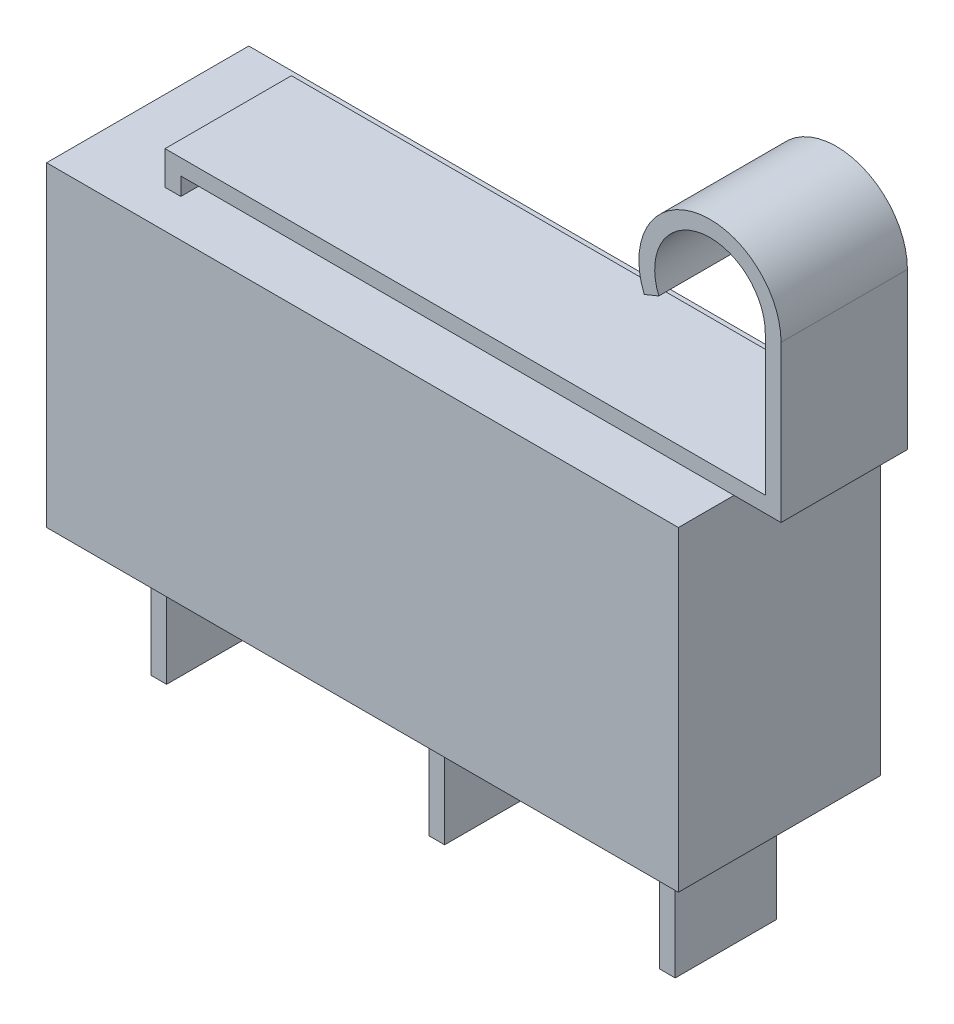
ISO-10303-21;
HEADER;
FILE_DESCRIPTION(('STEP AP214'),'2;1');
FILE_NAME('part.step','',(''),(''),'','','');
FILE_SCHEMA(('AUTOMOTIVE_DESIGN { 1 0 10303 214 1 1 1 1 }'));
ENDSEC;
DATA;
#1=APPLICATION_CONTEXT('core data for automotive mechanical design processes');
#2=APPLICATION_PROTOCOL_DEFINITION('international standard','automotive_design',2000,#1);
#3=PRODUCT_CONTEXT('',#1,'mechanical');
#4=PRODUCT('Part','Part','',(#3));
#5=PRODUCT_RELATED_PRODUCT_CATEGORY('part','',(#4));
#6=PRODUCT_DEFINITION_FORMATION('','',#4);
#7=PRODUCT_DEFINITION_CONTEXT('part definition',#1,'design');
#8=PRODUCT_DEFINITION('design','',#6,#7);
#9=PRODUCT_DEFINITION_SHAPE('','',#8);
#10=(LENGTH_UNIT() NAMED_UNIT(*) SI_UNIT(.MILLI.,.METRE.));
#11=(NAMED_UNIT(*) PLANE_ANGLE_UNIT() SI_UNIT($,.RADIAN.));
#12=(NAMED_UNIT(*) SI_UNIT($,.STERADIAN.) SOLID_ANGLE_UNIT());
#13=UNCERTAINTY_MEASURE_WITH_UNIT(LENGTH_MEASURE(1.E-05),#10,'distance_accuracy_value','');
#14=(GEOMETRIC_REPRESENTATION_CONTEXT(3) GLOBAL_UNCERTAINTY_ASSIGNED_CONTEXT((#13)) GLOBAL_UNIT_ASSIGNED_CONTEXT((#10,
#11,#12)) REPRESENTATION_CONTEXT('',''));
#15=CARTESIAN_POINT('',(0.,0.,0.));
#16=DIRECTION('',(0.,0.,1.));
#17=DIRECTION('',(1.,0.,0.));
#18=AXIS2_PLACEMENT_3D('',#15,#16,#17);
#19=CARTESIAN_POINT('',(-20.,0.,3.2));
#20=DIRECTION('',(0.,1.,0.));
#21=DIRECTION('',(0.,0.,1.));
#22=AXIS2_PLACEMENT_3D('',#19,#20,#21);
#23=PLANE('',#22);
#24=DIRECTION('',(0.,0.,1.));
#25=VECTOR('',#24,1.);
#26=CARTESIAN_POINT('',(-9.5,0.,1.6));
#27=LINE('',#26,#25);
#28=CARTESIAN_POINT('',(-9.5,0.,1.6));
#29=VERTEX_POINT('',#28);
#30=CARTESIAN_POINT('',(-9.5,0.,-1.6));
#31=VERTEX_POINT('',#30);
#32=EDGE_CURVE('E324',#29,#31,#27,.F.);
#33=ORIENTED_EDGE('',*,*,#32,.F.);
#34=DIRECTION('',(1.,0.,0.));
#35=VECTOR('',#34,1.);
#36=CARTESIAN_POINT('',(-9.5,0.,1.6));
#37=LINE('',#36,#35);
#38=CARTESIAN_POINT('',(-9.,0.,1.6));
#39=VERTEX_POINT('',#38);
#40=EDGE_CURVE('E328',#29,#39,#37,.T.);
#41=ORIENTED_EDGE('',*,*,#40,.T.);
#42=DIRECTION('',(0.,0.,1.));
#43=VECTOR('',#42,1.);
#44=CARTESIAN_POINT('',(-9.,0.,1.6));
#45=LINE('',#44,#43);
#46=CARTESIAN_POINT('',(-9.,0.,-1.6));
#47=VERTEX_POINT('',#46);
#48=EDGE_CURVE('E343',#39,#47,#45,.F.);
#49=ORIENTED_EDGE('',*,*,#48,.T.);
#50=DIRECTION('',(-1.,0.,0.));
#51=VECTOR('',#50,1.);
#52=CARTESIAN_POINT('',(-9.,0.,-1.6));
#53=LINE('',#52,#51);
#54=EDGE_CURVE('E340',#47,#31,#53,.T.);
#55=ORIENTED_EDGE('',*,*,#54,.T.);
#56=EDGE_LOOP('',(#33,#41,#49,#55));
#57=FACE_BOUND('',#56,.T.);
#58=DIRECTION('',(1.,0.,0.));
#59=VECTOR('',#58,1.);
#60=CARTESIAN_POINT('',(-20.,0.,-3.2));
#61=LINE('',#60,#59);
#62=CARTESIAN_POINT('',(-20.,0.,-3.2));
#63=VERTEX_POINT('',#62);
#64=CARTESIAN_POINT('',(0.,0.,-3.2));
#65=VERTEX_POINT('',#64);
#66=EDGE_CURVE('E402',#63,#65,#61,.T.);
#67=ORIENTED_EDGE('',*,*,#66,.T.);
#68=DIRECTION('',(0.,0.,-1.));
#69=VECTOR('',#68,1.);
#70=CARTESIAN_POINT('',(0.,0.,3.2));
#71=LINE('',#70,#69);
#72=CARTESIAN_POINT('',(0.,0.,3.2));
#73=VERTEX_POINT('',#72);
#74=EDGE_CURVE('E43',#73,#65,#71,.T.);
#75=ORIENTED_EDGE('',*,*,#74,.F.);
#76=DIRECTION('',(1.,0.,0.));
#77=VECTOR('',#76,1.);
#78=CARTESIAN_POINT('',(-20.,0.,3.2));
#79=LINE('',#78,#77);
#80=CARTESIAN_POINT('',(-20.,0.,3.2));
#81=VERTEX_POINT('',#80);
#82=EDGE_CURVE('E392',#81,#73,#79,.T.);
#83=ORIENTED_EDGE('',*,*,#82,.F.);
#84=DIRECTION('',(0.,0.,-1.));
#85=VECTOR('',#84,1.);
#86=CARTESIAN_POINT('',(-20.,0.,3.2));
#87=LINE('',#86,#85);
#88=EDGE_CURVE('E11',#81,#63,#87,.T.);
#89=ORIENTED_EDGE('',*,*,#88,.T.);
#90=EDGE_LOOP('',(#67,#75,#83,#89));
#91=FACE_BOUND('',#90,.T.);
#92=DIRECTION('',(0.,0.,1.));
#93=VECTOR('',#92,1.);
#94=CARTESIAN_POINT('',(-18.3,0.,1.6));
#95=LINE('',#94,#93);
#96=CARTESIAN_POINT('',(-18.3,0.,1.6));
#97=VERTEX_POINT('',#96);
#98=CARTESIAN_POINT('',(-18.3,0.,-1.6));
#99=VERTEX_POINT('',#98);
#100=EDGE_CURVE('E356',#97,#99,#95,.F.);
#101=ORIENTED_EDGE('',*,*,#100,.F.);
#102=DIRECTION('',(1.,0.,0.));
#103=VECTOR('',#102,1.);
#104=CARTESIAN_POINT('',(-18.3,0.,1.6));
#105=LINE('',#104,#103);
#106=CARTESIAN_POINT('',(-17.8,0.,1.6));
#107=VERTEX_POINT('',#106);
#108=EDGE_CURVE('E360',#97,#107,#105,.T.);
#109=ORIENTED_EDGE('',*,*,#108,.T.);
#110=DIRECTION('',(0.,0.,1.));
#111=VECTOR('',#110,1.);
#112=CARTESIAN_POINT('',(-17.8,0.,1.6));
#113=LINE('',#112,#111);
#114=CARTESIAN_POINT('',(-17.8,0.,-1.6));
#115=VERTEX_POINT('',#114);
#116=EDGE_CURVE('E375',#107,#115,#113,.F.);
#117=ORIENTED_EDGE('',*,*,#116,.T.);
#118=DIRECTION('',(-1.,0.,0.));
#119=VECTOR('',#118,1.);
#120=CARTESIAN_POINT('',(-17.8,0.,-1.6));
#121=LINE('',#120,#119);
#122=EDGE_CURVE('E372',#115,#99,#121,.T.);
#123=ORIENTED_EDGE('',*,*,#122,.T.);
#124=EDGE_LOOP('',(#101,#109,#117,#123));
#125=FACE_BOUND('',#124,.T.);
#126=DIRECTION('',(0.,0.,1.));
#127=VECTOR('',#126,1.);
#128=CARTESIAN_POINT('',(-2.2,0.,1.6));
#129=LINE('',#128,#127);
#130=CARTESIAN_POINT('',(-2.2,0.,1.6));
#131=VERTEX_POINT('',#130);
#132=CARTESIAN_POINT('',(-2.2,0.,-1.6));
#133=VERTEX_POINT('',#132);
#134=EDGE_CURVE('E229',#131,#133,#129,.F.);
#135=ORIENTED_EDGE('',*,*,#134,.F.);
#136=DIRECTION('',(1.,0.,0.));
#137=VECTOR('',#136,1.);
#138=CARTESIAN_POINT('',(-2.2,0.,1.6));
#139=LINE('',#138,#137);
#140=CARTESIAN_POINT('',(-1.7,0.,1.6));
#141=VERTEX_POINT('',#140);
#142=EDGE_CURVE('E296',#131,#141,#139,.T.);
#143=ORIENTED_EDGE('',*,*,#142,.T.);
#144=DIRECTION('',(0.,0.,1.));
#145=VECTOR('',#144,1.);
#146=CARTESIAN_POINT('',(-1.7,0.,1.6));
#147=LINE('',#146,#145);
#148=CARTESIAN_POINT('',(-1.7,0.,-1.6));
#149=VERTEX_POINT('',#148);
#150=EDGE_CURVE('E311',#141,#149,#147,.F.);
#151=ORIENTED_EDGE('',*,*,#150,.T.);
#152=DIRECTION('',(-1.,0.,0.));
#153=VECTOR('',#152,1.);
#154=CARTESIAN_POINT('',(-1.7,0.,-1.6));
#155=LINE('',#154,#153);
#156=EDGE_CURVE('E308',#149,#133,#155,.T.);
#157=ORIENTED_EDGE('',*,*,#156,.T.);
#158=EDGE_LOOP('',(#135,#143,#151,#157));
#159=FACE_BOUND('',#158,.T.);
#160=ADVANCED_FACE('F35',(#57,#91,#125,#159),#23,.F.);
#161=CARTESIAN_POINT('',(-20.,0.,3.2));
#162=DIRECTION('',(1.,0.,0.));
#163=DIRECTION('',(0.,0.,-1.));
#164=AXIS2_PLACEMENT_3D('',#161,#162,#163);
#165=PLANE('',#164);
#166=DIRECTION('',(0.,-1.,0.));
#167=VECTOR('',#166,1.);
#168=CARTESIAN_POINT('',(-20.,0.,-3.2));
#169=LINE('',#168,#167);
#170=CARTESIAN_POINT('',(-20.,10.,-3.2));
#171=VERTEX_POINT('',#170);
#172=EDGE_CURVE('E388',#171,#63,#169,.T.);
#173=ORIENTED_EDGE('',*,*,#172,.T.);
#174=ORIENTED_EDGE('',*,*,#88,.F.);
#175=DIRECTION('',(0.,-1.,0.));
#176=VECTOR('',#175,1.);
#177=CARTESIAN_POINT('',(-20.,0.,3.2));
#178=LINE('',#177,#176);
#179=CARTESIAN_POINT('',(-20.,10.,3.2));
#180=VERTEX_POINT('',#179);
#181=EDGE_CURVE('E389',#180,#81,#178,.T.);
#182=ORIENTED_EDGE('',*,*,#181,.F.);
#183=DIRECTION('',(0.,0.,-1.));
#184=VECTOR('',#183,1.);
#185=CARTESIAN_POINT('',(-20.,10.,3.2));
#186=LINE('',#185,#184);
#187=EDGE_CURVE('E399',#180,#171,#186,.T.);
#188=ORIENTED_EDGE('',*,*,#187,.T.);
#189=EDGE_LOOP('',(#173,#174,#182,#188));
#190=FACE_BOUND('',#189,.T.);
#191=ADVANCED_FACE('F37',(#190),#165,.F.);
#192=CARTESIAN_POINT('',(0.,0.,3.2));
#193=DIRECTION('',(-1.,0.,0.));
#194=DIRECTION('',(0.,0.,1.));
#195=AXIS2_PLACEMENT_3D('',#192,#193,#194);
#196=PLANE('',#195);
#197=DIRECTION('',(0.,1.,0.));
#198=VECTOR('',#197,1.);
#199=CARTESIAN_POINT('',(0.,0.,-3.2));
#200=LINE('',#199,#198);
#201=CARTESIAN_POINT('',(0.,10.,-3.2));
#202=VERTEX_POINT('',#201);
#203=EDGE_CURVE('E404',#65,#202,#200,.T.);
#204=ORIENTED_EDGE('',*,*,#203,.T.);
#205=DIRECTION('',(0.,0.,-1.));
#206=VECTOR('',#205,1.);
#207=CARTESIAN_POINT('',(0.,10.,3.2));
#208=LINE('',#207,#206);
#209=CARTESIAN_POINT('',(0.,10.,3.2));
#210=VERTEX_POINT('',#209);
#211=EDGE_CURVE('E409',#210,#202,#208,.T.);
#212=ORIENTED_EDGE('',*,*,#211,.F.);
#213=DIRECTION('',(0.,1.,0.));
#214=VECTOR('',#213,1.);
#215=CARTESIAN_POINT('',(0.,0.,3.2));
#216=LINE('',#215,#214);
#217=EDGE_CURVE('E395',#73,#210,#216,.T.);
#218=ORIENTED_EDGE('',*,*,#217,.F.);
#219=ORIENTED_EDGE('',*,*,#74,.T.);
#220=EDGE_LOOP('',(#204,#212,#218,#219));
#221=FACE_BOUND('',#220,.T.);
#222=ADVANCED_FACE('F416',(#221),#196,.F.);
#223=CARTESIAN_POINT('',(-20.,10.,3.2));
#224=DIRECTION('',(0.,-1.,0.));
#225=DIRECTION('',(0.,0.,-1.));
#226=AXIS2_PLACEMENT_3D('',#223,#224,#225);
#227=PLANE('',#226);
#228=DIRECTION('',(0.,0.,-1.));
#229=VECTOR('',#228,1.);
#230=CARTESIAN_POINT('',(-16.95,10.,2.));
#231=LINE('',#230,#229);
#232=CARTESIAN_POINT('',(-16.95,10.,2.));
#233=VERTEX_POINT('',#232);
#234=CARTESIAN_POINT('',(-16.95,10.,-2.));
#235=VERTEX_POINT('',#234);
#236=EDGE_CURVE('E55',#233,#235,#231,.T.);
#237=ORIENTED_EDGE('',*,*,#236,.F.);
#238=DIRECTION('',(-1.,0.,0.));
#239=VECTOR('',#238,1.);
#240=CARTESIAN_POINT('',(-16.95,10.,2.));
#241=LINE('',#240,#239);
#242=CARTESIAN_POINT('',(-17.45,10.,2.));
#243=VERTEX_POINT('',#242);
#244=EDGE_CURVE('E50',#233,#243,#241,.T.);
#245=ORIENTED_EDGE('',*,*,#244,.T.);
#246=DIRECTION('',(0.,0.,-1.));
#247=VECTOR('',#246,1.);
#248=CARTESIAN_POINT('',(-17.45,10.,2.));
#249=LINE('',#248,#247);
#250=CARTESIAN_POINT('',(-17.45,10.,-2.));
#251=VERTEX_POINT('',#250);
#252=EDGE_CURVE('E284',#243,#251,#249,.T.);
#253=ORIENTED_EDGE('',*,*,#252,.T.);
#254=DIRECTION('',(-1.,0.,0.));
#255=VECTOR('',#254,1.);
#256=CARTESIAN_POINT('',(-16.95,10.,-2.));
#257=LINE('',#256,#255);
#258=EDGE_CURVE('E268',#235,#251,#257,.T.);
#259=ORIENTED_EDGE('',*,*,#258,.F.);
#260=EDGE_LOOP('',(#237,#245,#253,#259));
#261=FACE_BOUND('',#260,.T.);
#262=DIRECTION('',(-1.,0.,0.));
#263=VECTOR('',#262,1.);
#264=CARTESIAN_POINT('',(-20.,10.,-3.2));
#265=LINE('',#264,#263);
#266=EDGE_CURVE('E393',#202,#171,#265,.T.);
#267=ORIENTED_EDGE('',*,*,#266,.T.);
#268=ORIENTED_EDGE('',*,*,#187,.F.);
#269=DIRECTION('',(-1.,0.,0.));
#270=VECTOR('',#269,1.);
#271=CARTESIAN_POINT('',(-20.,10.,3.2));
#272=LINE('',#271,#270);
#273=EDGE_CURVE('E397',#210,#180,#272,.T.);
#274=ORIENTED_EDGE('',*,*,#273,.F.);
#275=ORIENTED_EDGE('',*,*,#211,.T.);
#276=EDGE_LOOP('',(#267,#268,#274,#275));
#277=FACE_BOUND('',#276,.T.);
#278=ADVANCED_FACE('F425',(#261,#277),#227,.F.);
#279=CARTESIAN_POINT('',(0.,0.,3.2));
#280=DIRECTION('',(0.,0.,-1.));
#281=DIRECTION('',(-1.,0.,0.));
#282=AXIS2_PLACEMENT_3D('',#279,#280,#281);
#283=PLANE('',#282);
#284=ORIENTED_EDGE('',*,*,#181,.T.);
#285=ORIENTED_EDGE('',*,*,#82,.T.);
#286=ORIENTED_EDGE('',*,*,#217,.T.);
#287=ORIENTED_EDGE('',*,*,#273,.T.);
#288=EDGE_LOOP('',(#284,#285,#286,#287));
#289=FACE_BOUND('',#288,.T.);
#290=ADVANCED_FACE('F431',(#289),#283,.F.);
#291=CARTESIAN_POINT('',(0.,0.,-3.2));
#292=DIRECTION('',(0.,0.,-1.));
#293=DIRECTION('',(-1.,0.,0.));
#294=AXIS2_PLACEMENT_3D('',#291,#292,#293);
#295=PLANE('',#294);
#296=ORIENTED_EDGE('',*,*,#172,.F.);
#297=ORIENTED_EDGE('',*,*,#266,.F.);
#298=ORIENTED_EDGE('',*,*,#203,.F.);
#299=ORIENTED_EDGE('',*,*,#66,.F.);
#300=EDGE_LOOP('',(#296,#297,#298,#299));
#301=FACE_BOUND('',#300,.T.);
#302=ADVANCED_FACE('F422',(#301),#295,.T.);
#303=CARTESIAN_POINT('',(-18.3,-4.,1.6));
#304=DIRECTION('',(1.,0.,0.));
#305=DIRECTION('',(0.,0.,-1.));
#306=AXIS2_PLACEMENT_3D('',#303,#304,#305);
#307=PLANE('',#306);
#308=ORIENTED_EDGE('',*,*,#100,.T.);
#309=DIRECTION('',(0.,1.,0.));
#310=VECTOR('',#309,1.);
#311=CARTESIAN_POINT('',(-18.3,-4.,-1.6));
#312=LINE('',#311,#310);
#313=CARTESIAN_POINT('',(-18.3,-4.,-1.6));
#314=VERTEX_POINT('',#313);
#315=EDGE_CURVE('E386',#314,#99,#312,.T.);
#316=ORIENTED_EDGE('',*,*,#315,.F.);
#317=DIRECTION('',(0.,0.,1.));
#318=VECTOR('',#317,1.);
#319=CARTESIAN_POINT('',(-18.3,-4.,1.6));
#320=LINE('',#319,#318);
#321=CARTESIAN_POINT('',(-18.3,-4.,1.6));
#322=VERTEX_POINT('',#321);
#323=EDGE_CURVE('E357',#322,#314,#320,.F.);
#324=ORIENTED_EDGE('',*,*,#323,.F.);
#325=DIRECTION('',(0.,1.,0.));
#326=VECTOR('',#325,1.);
#327=CARTESIAN_POINT('',(-18.3,-4.,1.6));
#328=LINE('',#327,#326);
#329=EDGE_CURVE('E369',#322,#97,#328,.T.);
#330=ORIENTED_EDGE('',*,*,#329,.T.);
#331=EDGE_LOOP('',(#308,#316,#324,#330));
#332=FACE_BOUND('',#331,.T.);
#333=ADVANCED_FACE('F500',(#332),#307,.F.);
#334=CARTESIAN_POINT('',(-17.8,-4.,-1.6));
#335=DIRECTION('',(0.,0.,-1.));
#336=DIRECTION('',(-1.,0.,0.));
#337=AXIS2_PLACEMENT_3D('',#334,#335,#336);
#338=PLANE('',#337);
#339=ORIENTED_EDGE('',*,*,#122,.F.);
#340=DIRECTION('',(0.,1.,0.));
#341=VECTOR('',#340,1.);
#342=CARTESIAN_POINT('',(-17.8,-4.,-1.6));
#343=LINE('',#342,#341);
#344=CARTESIAN_POINT('',(-17.8,-4.,-1.6));
#345=VERTEX_POINT('',#344);
#346=EDGE_CURVE('E384',#345,#115,#343,.T.);
#347=ORIENTED_EDGE('',*,*,#346,.F.);
#348=DIRECTION('',(-1.,0.,0.));
#349=VECTOR('',#348,1.);
#350=CARTESIAN_POINT('',(-17.8,-4.,-1.6));
#351=LINE('',#350,#349);
#352=EDGE_CURVE('E359',#345,#314,#351,.T.);
#353=ORIENTED_EDGE('',*,*,#352,.T.);
#354=ORIENTED_EDGE('',*,*,#315,.T.);
#355=EDGE_LOOP('',(#339,#347,#353,#354));
#356=FACE_BOUND('',#355,.T.);
#357=ADVANCED_FACE('F496',(#356),#338,.T.);
#358=CARTESIAN_POINT('',(-17.8,-4.,1.6));
#359=DIRECTION('',(1.,0.,0.));
#360=DIRECTION('',(0.,0.,-1.));
#361=AXIS2_PLACEMENT_3D('',#358,#359,#360);
#362=PLANE('',#361);
#363=ORIENTED_EDGE('',*,*,#116,.F.);
#364=DIRECTION('',(0.,1.,0.));
#365=VECTOR('',#364,1.);
#366=CARTESIAN_POINT('',(-17.8,-4.,1.6));
#367=LINE('',#366,#365);
#368=CARTESIAN_POINT('',(-17.8,-4.,1.6));
#369=VERTEX_POINT('',#368);
#370=EDGE_CURVE('E381',#369,#107,#367,.T.);
#371=ORIENTED_EDGE('',*,*,#370,.F.);
#372=DIRECTION('',(0.,0.,1.));
#373=VECTOR('',#372,1.);
#374=CARTESIAN_POINT('',(-17.8,-4.,1.6));
#375=LINE('',#374,#373);
#376=EDGE_CURVE('E363',#369,#345,#375,.F.);
#377=ORIENTED_EDGE('',*,*,#376,.T.);
#378=ORIENTED_EDGE('',*,*,#346,.T.);
#379=EDGE_LOOP('',(#363,#371,#377,#378));
#380=FACE_BOUND('',#379,.T.);
#381=ADVANCED_FACE('F492',(#380),#362,.T.);
#382=CARTESIAN_POINT('',(-18.3,-4.,1.6));
#383=DIRECTION('',(0.,0.,1.));
#384=DIRECTION('',(1.,0.,0.));
#385=AXIS2_PLACEMENT_3D('',#382,#383,#384);
#386=PLANE('',#385);
#387=ORIENTED_EDGE('',*,*,#108,.F.);
#388=ORIENTED_EDGE('',*,*,#329,.F.);
#389=DIRECTION('',(1.,0.,0.));
#390=VECTOR('',#389,1.);
#391=CARTESIAN_POINT('',(-18.3,-4.,1.6));
#392=LINE('',#391,#390);
#393=EDGE_CURVE('E366',#322,#369,#392,.T.);
#394=ORIENTED_EDGE('',*,*,#393,.T.);
#395=ORIENTED_EDGE('',*,*,#370,.T.);
#396=EDGE_LOOP('',(#387,#388,#394,#395));
#397=FACE_BOUND('',#396,.T.);
#398=ADVANCED_FACE('F488',(#397),#386,.T.);
#399=CARTESIAN_POINT('',(0.,-4.,0.));
#400=DIRECTION('',(0.,-1.,0.));
#401=DIRECTION('',(1.,0.,0.));
#402=AXIS2_PLACEMENT_3D('',#399,#400,#401);
#403=PLANE('',#402);
#404=ORIENTED_EDGE('',*,*,#323,.T.);
#405=ORIENTED_EDGE('',*,*,#352,.F.);
#406=ORIENTED_EDGE('',*,*,#376,.F.);
#407=ORIENTED_EDGE('',*,*,#393,.F.);
#408=EDGE_LOOP('',(#404,#405,#406,#407));
#409=FACE_BOUND('',#408,.T.);
#410=ADVANCED_FACE('F484',(#409),#403,.T.);
#411=CARTESIAN_POINT('',(-9.5,-4.,1.6));
#412=DIRECTION('',(1.,0.,0.));
#413=DIRECTION('',(0.,0.,-1.));
#414=AXIS2_PLACEMENT_3D('',#411,#412,#413);
#415=PLANE('',#414);
#416=ORIENTED_EDGE('',*,*,#32,.T.);
#417=DIRECTION('',(0.,1.,0.));
#418=VECTOR('',#417,1.);
#419=CARTESIAN_POINT('',(-9.5,-4.,-1.6));
#420=LINE('',#419,#418);
#421=CARTESIAN_POINT('',(-9.5,-4.,-1.6));
#422=VERTEX_POINT('',#421);
#423=EDGE_CURVE('E354',#422,#31,#420,.T.);
#424=ORIENTED_EDGE('',*,*,#423,.F.);
#425=DIRECTION('',(0.,0.,1.));
#426=VECTOR('',#425,1.);
#427=CARTESIAN_POINT('',(-9.5,-4.,1.6));
#428=LINE('',#427,#426);
#429=CARTESIAN_POINT('',(-9.5,-4.,1.6));
#430=VERTEX_POINT('',#429);
#431=EDGE_CURVE('E325',#430,#422,#428,.F.);
#432=ORIENTED_EDGE('',*,*,#431,.F.);
#433=DIRECTION('',(0.,1.,0.));
#434=VECTOR('',#433,1.);
#435=CARTESIAN_POINT('',(-9.5,-4.,1.6));
#436=LINE('',#435,#434);
#437=EDGE_CURVE('E337',#430,#29,#436,.T.);
#438=ORIENTED_EDGE('',*,*,#437,.T.);
#439=EDGE_LOOP('',(#416,#424,#432,#438));
#440=FACE_BOUND('',#439,.T.);
#441=ADVANCED_FACE('F480',(#440),#415,.F.);
#442=CARTESIAN_POINT('',(-9.,-4.,-1.6));
#443=DIRECTION('',(0.,0.,-1.));
#444=DIRECTION('',(-1.,0.,0.));
#445=AXIS2_PLACEMENT_3D('',#442,#443,#444);
#446=PLANE('',#445);
#447=ORIENTED_EDGE('',*,*,#54,.F.);
#448=DIRECTION('',(0.,1.,0.));
#449=VECTOR('',#448,1.);
#450=CARTESIAN_POINT('',(-9.,-4.,-1.6));
#451=LINE('',#450,#449);
#452=CARTESIAN_POINT('',(-9.,-4.,-1.6));
#453=VERTEX_POINT('',#452);
#454=EDGE_CURVE('E352',#453,#47,#451,.T.);
#455=ORIENTED_EDGE('',*,*,#454,.F.);
#456=DIRECTION('',(-1.,0.,0.));
#457=VECTOR('',#456,1.);
#458=CARTESIAN_POINT('',(-9.,-4.,-1.6));
#459=LINE('',#458,#457);
#460=EDGE_CURVE('E327',#453,#422,#459,.T.);
#461=ORIENTED_EDGE('',*,*,#460,.T.);
#462=ORIENTED_EDGE('',*,*,#423,.T.);
#463=EDGE_LOOP('',(#447,#455,#461,#462));
#464=FACE_BOUND('',#463,.T.);
#465=ADVANCED_FACE('F476',(#464),#446,.T.);
#466=CARTESIAN_POINT('',(-9.,-4.,1.6));
#467=DIRECTION('',(1.,0.,0.));
#468=DIRECTION('',(0.,0.,-1.));
#469=AXIS2_PLACEMENT_3D('',#466,#467,#468);
#470=PLANE('',#469);
#471=ORIENTED_EDGE('',*,*,#48,.F.);
#472=DIRECTION('',(0.,1.,0.));
#473=VECTOR('',#472,1.);
#474=CARTESIAN_POINT('',(-9.,-4.,1.6));
#475=LINE('',#474,#473);
#476=CARTESIAN_POINT('',(-9.,-4.,1.6));
#477=VERTEX_POINT('',#476);
#478=EDGE_CURVE('E349',#477,#39,#475,.T.);
#479=ORIENTED_EDGE('',*,*,#478,.F.);
#480=DIRECTION('',(0.,0.,1.));
#481=VECTOR('',#480,1.);
#482=CARTESIAN_POINT('',(-9.,-4.,1.6));
#483=LINE('',#482,#481);
#484=EDGE_CURVE('E331',#477,#453,#483,.F.);
#485=ORIENTED_EDGE('',*,*,#484,.T.);
#486=ORIENTED_EDGE('',*,*,#454,.T.);
#487=EDGE_LOOP('',(#471,#479,#485,#486));
#488=FACE_BOUND('',#487,.T.);
#489=ADVANCED_FACE('F472',(#488),#470,.T.);
#490=CARTESIAN_POINT('',(-9.5,-4.,1.6));
#491=DIRECTION('',(0.,0.,1.));
#492=DIRECTION('',(1.,0.,0.));
#493=AXIS2_PLACEMENT_3D('',#490,#491,#492);
#494=PLANE('',#493);
#495=ORIENTED_EDGE('',*,*,#40,.F.);
#496=ORIENTED_EDGE('',*,*,#437,.F.);
#497=DIRECTION('',(1.,0.,0.));
#498=VECTOR('',#497,1.);
#499=CARTESIAN_POINT('',(-9.5,-4.,1.6));
#500=LINE('',#499,#498);
#501=EDGE_CURVE('E334',#430,#477,#500,.T.);
#502=ORIENTED_EDGE('',*,*,#501,.T.);
#503=ORIENTED_EDGE('',*,*,#478,.T.);
#504=EDGE_LOOP('',(#495,#496,#502,#503));
#505=FACE_BOUND('',#504,.T.);
#506=ADVANCED_FACE('F468',(#505),#494,.T.);
#507=CARTESIAN_POINT('',(0.,-4.,0.));
#508=DIRECTION('',(0.,-1.,0.));
#509=DIRECTION('',(1.,0.,0.));
#510=AXIS2_PLACEMENT_3D('',#507,#508,#509);
#511=PLANE('',#510);
#512=ORIENTED_EDGE('',*,*,#431,.T.);
#513=ORIENTED_EDGE('',*,*,#460,.F.);
#514=ORIENTED_EDGE('',*,*,#484,.F.);
#515=ORIENTED_EDGE('',*,*,#501,.F.);
#516=EDGE_LOOP('',(#512,#513,#514,#515));
#517=FACE_BOUND('',#516,.T.);
#518=ADVANCED_FACE('F462',(#517),#511,.T.);
#519=CARTESIAN_POINT('',(-2.2,-4.,1.6));
#520=DIRECTION('',(1.,0.,0.));
#521=DIRECTION('',(0.,0.,-1.));
#522=AXIS2_PLACEMENT_3D('',#519,#520,#521);
#523=PLANE('',#522);
#524=ORIENTED_EDGE('',*,*,#134,.T.);
#525=DIRECTION('',(0.,1.,0.));
#526=VECTOR('',#525,1.);
#527=CARTESIAN_POINT('',(-2.2,-4.,-1.6));
#528=LINE('',#527,#526);
#529=CARTESIAN_POINT('',(-2.2,-4.,-1.6));
#530=VERTEX_POINT('',#529);
#531=EDGE_CURVE('E322',#530,#133,#528,.T.);
#532=ORIENTED_EDGE('',*,*,#531,.F.);
#533=DIRECTION('',(0.,0.,1.));
#534=VECTOR('',#533,1.);
#535=CARTESIAN_POINT('',(-2.2,-4.,1.6));
#536=LINE('',#535,#534);
#537=CARTESIAN_POINT('',(-2.2,-4.,1.6));
#538=VERTEX_POINT('',#537);
#539=EDGE_CURVE('E293',#538,#530,#536,.F.);
#540=ORIENTED_EDGE('',*,*,#539,.F.);
#541=DIRECTION('',(0.,1.,0.));
#542=VECTOR('',#541,1.);
#543=CARTESIAN_POINT('',(-2.2,-4.,1.6));
#544=LINE('',#543,#542);
#545=EDGE_CURVE('E305',#538,#131,#544,.T.);
#546=ORIENTED_EDGE('',*,*,#545,.T.);
#547=EDGE_LOOP('',(#524,#532,#540,#546));
#548=FACE_BOUND('',#547,.T.);
#549=ADVANCED_FACE('F442',(#548),#523,.F.);
#550=CARTESIAN_POINT('',(-1.7,-4.,-1.6));
#551=DIRECTION('',(0.,0.,-1.));
#552=DIRECTION('',(-1.,0.,0.));
#553=AXIS2_PLACEMENT_3D('',#550,#551,#552);
#554=PLANE('',#553);
#555=ORIENTED_EDGE('',*,*,#156,.F.);
#556=DIRECTION('',(0.,1.,0.));
#557=VECTOR('',#556,1.);
#558=CARTESIAN_POINT('',(-1.7,-4.,-1.6));
#559=LINE('',#558,#557);
#560=CARTESIAN_POINT('',(-1.7,-4.,-1.6));
#561=VERTEX_POINT('',#560);
#562=EDGE_CURVE('E320',#561,#149,#559,.T.);
#563=ORIENTED_EDGE('',*,*,#562,.F.);
#564=DIRECTION('',(-1.,0.,0.));
#565=VECTOR('',#564,1.);
#566=CARTESIAN_POINT('',(-1.7,-4.,-1.6));
#567=LINE('',#566,#565);
#568=EDGE_CURVE('E295',#561,#530,#567,.T.);
#569=ORIENTED_EDGE('',*,*,#568,.T.);
#570=ORIENTED_EDGE('',*,*,#531,.T.);
#571=EDGE_LOOP('',(#555,#563,#569,#570));
#572=FACE_BOUND('',#571,.T.);
#573=ADVANCED_FACE('F454',(#572),#554,.T.);
#574=CARTESIAN_POINT('',(-1.7,-4.,1.6));
#575=DIRECTION('',(1.,0.,0.));
#576=DIRECTION('',(0.,0.,-1.));
#577=AXIS2_PLACEMENT_3D('',#574,#575,#576);
#578=PLANE('',#577);
#579=ORIENTED_EDGE('',*,*,#150,.F.);
#580=DIRECTION('',(0.,1.,0.));
#581=VECTOR('',#580,1.);
#582=CARTESIAN_POINT('',(-1.7,-4.,1.6));
#583=LINE('',#582,#581);
#584=CARTESIAN_POINT('',(-1.7,-4.,1.6));
#585=VERTEX_POINT('',#584);
#586=EDGE_CURVE('E317',#585,#141,#583,.T.);
#587=ORIENTED_EDGE('',*,*,#586,.F.);
#588=DIRECTION('',(0.,0.,1.));
#589=VECTOR('',#588,1.);
#590=CARTESIAN_POINT('',(-1.7,-4.,1.6));
#591=LINE('',#590,#589);
#592=EDGE_CURVE('E299',#585,#561,#591,.F.);
#593=ORIENTED_EDGE('',*,*,#592,.T.);
#594=ORIENTED_EDGE('',*,*,#562,.T.);
#595=EDGE_LOOP('',(#579,#587,#593,#594));
#596=FACE_BOUND('',#595,.T.);
#597=ADVANCED_FACE('F449',(#596),#578,.T.);
#598=CARTESIAN_POINT('',(-2.2,-4.,1.6));
#599=DIRECTION('',(0.,0.,1.));
#600=DIRECTION('',(1.,0.,0.));
#601=AXIS2_PLACEMENT_3D('',#598,#599,#600);
#602=PLANE('',#601);
#603=ORIENTED_EDGE('',*,*,#142,.F.);
#604=ORIENTED_EDGE('',*,*,#545,.F.);
#605=DIRECTION('',(1.,0.,0.));
#606=VECTOR('',#605,1.);
#607=CARTESIAN_POINT('',(-2.2,-4.,1.6));
#608=LINE('',#607,#606);
#609=EDGE_CURVE('E302',#538,#585,#608,.T.);
#610=ORIENTED_EDGE('',*,*,#609,.T.);
#611=ORIENTED_EDGE('',*,*,#586,.T.);
#612=EDGE_LOOP('',(#603,#604,#610,#611));
#613=FACE_BOUND('',#612,.T.);
#614=ADVANCED_FACE('F446',(#613),#602,.T.);
#615=CARTESIAN_POINT('',(0.,-4.,0.));
#616=DIRECTION('',(0.,-1.,0.));
#617=DIRECTION('',(1.,0.,0.));
#618=AXIS2_PLACEMENT_3D('',#615,#616,#617);
#619=PLANE('',#618);
#620=ORIENTED_EDGE('',*,*,#539,.T.);
#621=ORIENTED_EDGE('',*,*,#568,.F.);
#622=ORIENTED_EDGE('',*,*,#592,.F.);
#623=ORIENTED_EDGE('',*,*,#609,.F.);
#624=EDGE_LOOP('',(#620,#621,#622,#623));
#625=FACE_BOUND('',#624,.T.);
#626=ADVANCED_FACE('F452',(#625),#619,.T.);
#627=CARTESIAN_POINT('',(-0.199999999999999,15.5,2.));
#628=DIRECTION('',(0.,0.,-1.));
#629=DIRECTION('',(-1.,0.,0.));
#630=AXIS2_PLACEMENT_3D('',#627,#628,#629);
#631=CYLINDRICAL_SURFACE('',#630,2.25);
#632=CARTESIAN_POINT('',(-0.199999999999999,15.5,-2.));
#633=DIRECTION('',(0.,0.,1.));
#634=DIRECTION('',(1.,0.,0.));
#635=AXIS2_PLACEMENT_3D('',#632,#633,#634);
#636=CIRCLE('',#635,2.25);
#637=CARTESIAN_POINT('',(2.05,15.5,-2.));
#638=VERTEX_POINT('',#637);
#639=CARTESIAN_POINT('',(-2.2825276541445,14.6481910016187,-2.));
#640=VERTEX_POINT('',#639);
#641=EDGE_CURVE('E225',#638,#640,#636,.T.);
#642=ORIENTED_EDGE('',*,*,#641,.T.);
#643=DIRECTION('',(0.,0.,-1.));
#644=VECTOR('',#643,1.);
#645=CARTESIAN_POINT('',(-2.2825276541445,14.6481910016187,2.));
#646=LINE('',#645,#644);
#647=CARTESIAN_POINT('',(-2.2825276541445,14.6481910016187,2.));
#648=VERTEX_POINT('',#647);
#649=EDGE_CURVE('E222',#648,#640,#646,.T.);
#650=ORIENTED_EDGE('',*,*,#649,.F.);
#651=CARTESIAN_POINT('',(-0.199999999999999,15.5,2.));
#652=DIRECTION('',(0.,0.,1.));
#653=DIRECTION('',(1.,0.,0.));
#654=AXIS2_PLACEMENT_3D('',#651,#652,#653);
#655=CIRCLE('',#654,2.25);
#656=CARTESIAN_POINT('',(2.05,15.5,2.));
#657=VERTEX_POINT('',#656);
#658=EDGE_CURVE('E207',#657,#648,#655,.T.);
#659=ORIENTED_EDGE('',*,*,#658,.F.);
#660=DIRECTION('',(0.,0.,-1.));
#661=VECTOR('',#660,1.);
#662=CARTESIAN_POINT('',(2.05,15.5,2.));
#663=LINE('',#662,#661);
#664=EDGE_CURVE('E252',#657,#638,#663,.T.);
#665=ORIENTED_EDGE('',*,*,#664,.T.);
#666=EDGE_LOOP('',(#642,#650,#659,#665));
#667=FACE_BOUND('',#666,.T.);
#668=ADVANCED_FACE('F223',(#667),#631,.T.);
#669=CARTESIAN_POINT('',(-1.81974373100127,14.8374818901479,2.));
#670=DIRECTION('',(0.378581777058372,-0.925567846286444,0.));
#671=DIRECTION('',(0.925567846286444,0.378581777058372,0.));
#672=AXIS2_PLACEMENT_3D('',#669,#670,#671);
#673=PLANE('',#672);
#674=DIRECTION('',(-0.925567846286444,-0.378581777058372,0.));
#675=VECTOR('',#674,1.);
#676=CARTESIAN_POINT('',(-1.81974373100127,14.8374818901479,-2.));
#677=LINE('',#676,#675);
#678=CARTESIAN_POINT('',(-1.81974373100127,14.8374818901479,-2.));
#679=VERTEX_POINT('',#678);
#680=EDGE_CURVE('E254',#679,#640,#677,.T.);
#681=ORIENTED_EDGE('',*,*,#680,.F.);
#682=DIRECTION('',(0.,0.,-1.));
#683=VECTOR('',#682,1.);
#684=CARTESIAN_POINT('',(-1.81974373100127,14.8374818901479,2.));
#685=LINE('',#684,#683);
#686=CARTESIAN_POINT('',(-1.81974373100127,14.8374818901479,2.));
#687=VERTEX_POINT('',#686);
#688=EDGE_CURVE('E230',#687,#679,#685,.T.);
#689=ORIENTED_EDGE('',*,*,#688,.F.);
#690=DIRECTION('',(-0.925567846286444,-0.378581777058372,0.));
#691=VECTOR('',#690,1.);
#692=CARTESIAN_POINT('',(-1.81974373100127,14.8374818901479,2.));
#693=LINE('',#692,#691);
#694=EDGE_CURVE('E212',#687,#648,#693,.T.);
#695=ORIENTED_EDGE('',*,*,#694,.T.);
#696=ORIENTED_EDGE('',*,*,#649,.T.);
#697=EDGE_LOOP('',(#681,#689,#695,#696));
#698=FACE_BOUND('',#697,.T.);
#699=ADVANCED_FACE('F232',(#698),#673,.T.);
#700=CARTESIAN_POINT('',(-0.199999999999999,15.5,2.));
#701=DIRECTION('',(0.,0.,-1.));
#702=DIRECTION('',(-1.,0.,0.));
#703=AXIS2_PLACEMENT_3D('',#700,#701,#702);
#704=CYLINDRICAL_SURFACE('',#703,1.75);
#705=CARTESIAN_POINT('',(-0.199999999999999,15.5,-2.));
#706=DIRECTION('',(0.,0.,1.));
#707=DIRECTION('',(1.,0.,0.));
#708=AXIS2_PLACEMENT_3D('',#705,#706,#707);
#709=CIRCLE('',#708,1.75);
#710=CARTESIAN_POINT('',(1.55,15.5,-2.));
#711=VERTEX_POINT('',#710);
#712=EDGE_CURVE('E256',#711,#679,#709,.T.);
#713=ORIENTED_EDGE('',*,*,#712,.F.);
#714=DIRECTION('',(0.,0.,-1.));
#715=VECTOR('',#714,1.);
#716=CARTESIAN_POINT('',(1.55,15.5,2.));
#717=LINE('',#716,#715);
#718=CARTESIAN_POINT('',(1.55,15.5,2.));
#719=VERTEX_POINT('',#718);
#720=EDGE_CURVE('E290',#719,#711,#717,.T.);
#721=ORIENTED_EDGE('',*,*,#720,.F.);
#722=CARTESIAN_POINT('',(-0.199999999999999,15.5,2.));
#723=DIRECTION('',(0.,0.,1.));
#724=DIRECTION('',(1.,0.,0.));
#725=AXIS2_PLACEMENT_3D('',#722,#723,#724);
#726=CIRCLE('',#725,1.75);
#727=EDGE_CURVE('E233',#719,#687,#726,.T.);
#728=ORIENTED_EDGE('',*,*,#727,.T.);
#729=ORIENTED_EDGE('',*,*,#688,.T.);
#730=EDGE_LOOP('',(#713,#721,#728,#729));
#731=FACE_BOUND('',#730,.T.);
#732=ADVANCED_FACE('F641',(#731),#704,.F.);
#733=CARTESIAN_POINT('',(1.55,10.8112767313075,2.));
#734=DIRECTION('',(-1.,0.,0.));
#735=DIRECTION('',(0.,-1.,0.));
#736=AXIS2_PLACEMENT_3D('',#733,#734,#735);
#737=PLANE('',#736);
#738=DIRECTION('',(0.,1.,0.));
#739=VECTOR('',#738,1.);
#740=CARTESIAN_POINT('',(1.55,10.8112767313075,-2.));
#741=LINE('',#740,#739);
#742=CARTESIAN_POINT('',(1.55,11.0612767313075,-2.));
#743=VERTEX_POINT('',#742);
#744=EDGE_CURVE('E259',#743,#711,#741,.T.);
#745=ORIENTED_EDGE('',*,*,#744,.F.);
#746=DIRECTION('',(0.,0.,-1.));
#747=VECTOR('',#746,1.);
#748=CARTESIAN_POINT('',(1.55,11.0612767313075,2.));
#749=LINE('',#748,#747);
#750=CARTESIAN_POINT('',(1.55,11.0612767313075,2.));
#751=VERTEX_POINT('',#750);
#752=EDGE_CURVE('E288',#751,#743,#749,.T.);
#753=ORIENTED_EDGE('',*,*,#752,.F.);
#754=DIRECTION('',(0.,1.,0.));
#755=VECTOR('',#754,1.);
#756=CARTESIAN_POINT('',(1.55,10.8112767313075,2.));
#757=LINE('',#756,#755);
#758=EDGE_CURVE('E235',#751,#719,#757,.T.);
#759=ORIENTED_EDGE('',*,*,#758,.T.);
#760=ORIENTED_EDGE('',*,*,#720,.T.);
#761=EDGE_LOOP('',(#745,#753,#759,#760));
#762=FACE_BOUND('',#761,.T.);
#763=ADVANCED_FACE('F650',(#762),#737,.T.);
#764=CARTESIAN_POINT('',(-17.2,11.0612767313075,2.));
#765=DIRECTION('',(0.,1.,0.));
#766=DIRECTION('',(0.,0.,1.));
#767=AXIS2_PLACEMENT_3D('',#764,#765,#766);
#768=PLANE('',#767);
#769=DIRECTION('',(1.,0.,0.));
#770=VECTOR('',#769,1.);
#771=CARTESIAN_POINT('',(-17.2,11.0612767313075,-2.));
#772=LINE('',#771,#770);
#773=CARTESIAN_POINT('',(-17.45,11.0612767313075,-2.));
#774=VERTEX_POINT('',#773);
#775=EDGE_CURVE('E262',#774,#743,#772,.T.);
#776=ORIENTED_EDGE('',*,*,#775,.F.);
#777=DIRECTION('',(0.,0.,-1.));
#778=VECTOR('',#777,1.);
#779=CARTESIAN_POINT('',(-17.45,11.0612767313075,2.));
#780=LINE('',#779,#778);
#781=CARTESIAN_POINT('',(-17.45,11.0612767313075,2.));
#782=VERTEX_POINT('',#781);
#783=EDGE_CURVE('E286',#782,#774,#780,.T.);
#784=ORIENTED_EDGE('',*,*,#783,.F.);
#785=DIRECTION('',(1.,0.,0.));
#786=VECTOR('',#785,1.);
#787=CARTESIAN_POINT('',(-17.2,11.0612767313075,2.));
#788=LINE('',#787,#786);
#789=EDGE_CURVE('E240',#782,#751,#788,.T.);
#790=ORIENTED_EDGE('',*,*,#789,.T.);
#791=ORIENTED_EDGE('',*,*,#752,.T.);
#792=EDGE_LOOP('',(#776,#784,#790,#791));
#793=FACE_BOUND('',#792,.T.);
#794=ADVANCED_FACE('F660',(#793),#768,.T.);
#795=CARTESIAN_POINT('',(-17.45,10.,2.));
#796=DIRECTION('',(-1.,0.,0.));
#797=DIRECTION('',(0.,0.,1.));
#798=AXIS2_PLACEMENT_3D('',#795,#796,#797);
#799=PLANE('',#798);
#800=DIRECTION('',(0.,1.,0.));
#801=VECTOR('',#800,1.);
#802=CARTESIAN_POINT('',(-17.45,10.,-2.));
#803=LINE('',#802,#801);
#804=EDGE_CURVE('E265',#251,#774,#803,.T.);
#805=ORIENTED_EDGE('',*,*,#804,.F.);
#806=ORIENTED_EDGE('',*,*,#252,.F.);
#807=DIRECTION('',(0.,1.,0.));
#808=VECTOR('',#807,1.);
#809=CARTESIAN_POINT('',(-17.45,10.,2.));
#810=LINE('',#809,#808);
#811=EDGE_CURVE('E243',#243,#782,#810,.T.);
#812=ORIENTED_EDGE('',*,*,#811,.T.);
#813=ORIENTED_EDGE('',*,*,#783,.T.);
#814=EDGE_LOOP('',(#805,#806,#812,#813));
#815=FACE_BOUND('',#814,.T.);
#816=ADVANCED_FACE('F670',(#815),#799,.T.);
#817=CARTESIAN_POINT('',(-16.95,10.,2.));
#818=DIRECTION('',(-1.,0.,0.));
#819=DIRECTION('',(0.,0.,1.));
#820=AXIS2_PLACEMENT_3D('',#817,#818,#819);
#821=PLANE('',#820);
#822=DIRECTION('',(0.,1.,0.));
#823=VECTOR('',#822,1.);
#824=CARTESIAN_POINT('',(-16.95,10.,-2.));
#825=LINE('',#824,#823);
#826=CARTESIAN_POINT('',(-16.95,10.5612767313075,-2.));
#827=VERTEX_POINT('',#826);
#828=EDGE_CURVE('E271',#235,#827,#825,.T.);
#829=ORIENTED_EDGE('',*,*,#828,.T.);
#830=DIRECTION('',(0.,0.,-1.));
#831=VECTOR('',#830,1.);
#832=CARTESIAN_POINT('',(-16.95,10.5612767313075,2.));
#833=LINE('',#832,#831);
#834=CARTESIAN_POINT('',(-16.95,10.5612767313075,2.));
#835=VERTEX_POINT('',#834);
#836=EDGE_CURVE('E280',#835,#827,#833,.T.);
#837=ORIENTED_EDGE('',*,*,#836,.F.);
#838=DIRECTION('',(0.,1.,0.));
#839=VECTOR('',#838,1.);
#840=CARTESIAN_POINT('',(-16.95,10.,2.));
#841=LINE('',#840,#839);
#842=EDGE_CURVE('E247',#233,#835,#841,.T.);
#843=ORIENTED_EDGE('',*,*,#842,.F.);
#844=ORIENTED_EDGE('',*,*,#236,.T.);
#845=EDGE_LOOP('',(#829,#837,#843,#844));
#846=FACE_BOUND('',#845,.T.);
#847=ADVANCED_FACE('F680',(#846),#821,.F.);
#848=CARTESIAN_POINT('',(-17.2,10.5612767313075,2.));
#849=DIRECTION('',(0.,1.,0.));
#850=DIRECTION('',(0.,0.,1.));
#851=AXIS2_PLACEMENT_3D('',#848,#849,#850);
#852=PLANE('',#851);
#853=DIRECTION('',(1.,0.,0.));
#854=VECTOR('',#853,1.);
#855=CARTESIAN_POINT('',(-17.2,10.5612767313075,-2.));
#856=LINE('',#855,#854);
#857=CARTESIAN_POINT('',(2.05,10.5612767313075,-2.));
#858=VERTEX_POINT('',#857);
#859=EDGE_CURVE('E273',#827,#858,#856,.T.);
#860=ORIENTED_EDGE('',*,*,#859,.T.);
#861=DIRECTION('',(0.,0.,-1.));
#862=VECTOR('',#861,1.);
#863=CARTESIAN_POINT('',(2.05,10.5612767313075,2.));
#864=LINE('',#863,#862);
#865=CARTESIAN_POINT('',(2.05,10.5612767313075,2.));
#866=VERTEX_POINT('',#865);
#867=EDGE_CURVE('E277',#866,#858,#864,.T.);
#868=ORIENTED_EDGE('',*,*,#867,.F.);
#869=DIRECTION('',(1.,0.,0.));
#870=VECTOR('',#869,1.);
#871=CARTESIAN_POINT('',(-17.2,10.5612767313075,2.));
#872=LINE('',#871,#870);
#873=EDGE_CURVE('E249',#835,#866,#872,.T.);
#874=ORIENTED_EDGE('',*,*,#873,.F.);
#875=ORIENTED_EDGE('',*,*,#836,.T.);
#876=EDGE_LOOP('',(#860,#868,#874,#875));
#877=FACE_BOUND('',#876,.T.);
#878=ADVANCED_FACE('F690',(#877),#852,.F.);
#879=CARTESIAN_POINT('',(2.05,10.8112767313075,2.));
#880=DIRECTION('',(-1.,0.,0.));
#881=DIRECTION('',(0.,-1.,0.));
#882=AXIS2_PLACEMENT_3D('',#879,#880,#881);
#883=PLANE('',#882);
#884=DIRECTION('',(0.,1.,0.));
#885=VECTOR('',#884,1.);
#886=CARTESIAN_POINT('',(2.05,10.8112767313075,-2.));
#887=LINE('',#886,#885);
#888=EDGE_CURVE('E219',#858,#638,#887,.T.);
#889=ORIENTED_EDGE('',*,*,#888,.T.);
#890=ORIENTED_EDGE('',*,*,#664,.F.);
#891=DIRECTION('',(0.,1.,0.));
#892=VECTOR('',#891,1.);
#893=CARTESIAN_POINT('',(2.05,10.8112767313075,2.));
#894=LINE('',#893,#892);
#895=EDGE_CURVE('E215',#866,#657,#894,.T.);
#896=ORIENTED_EDGE('',*,*,#895,.F.);
#897=ORIENTED_EDGE('',*,*,#867,.T.);
#898=EDGE_LOOP('',(#889,#890,#896,#897));
#899=FACE_BOUND('',#898,.T.);
#900=ADVANCED_FACE('F700',(#899),#883,.F.);
#901=CARTESIAN_POINT('',(-0.199999999999999,15.5,2.));
#902=DIRECTION('',(0.,0.,1.));
#903=DIRECTION('',(1.,0.,0.));
#904=AXIS2_PLACEMENT_3D('',#901,#902,#903);
#905=PLANE('',#904);
#906=ORIENTED_EDGE('',*,*,#658,.T.);
#907=ORIENTED_EDGE('',*,*,#694,.F.);
#908=ORIENTED_EDGE('',*,*,#727,.F.);
#909=ORIENTED_EDGE('',*,*,#758,.F.);
#910=ORIENTED_EDGE('',*,*,#789,.F.);
#911=ORIENTED_EDGE('',*,*,#811,.F.);
#912=ORIENTED_EDGE('',*,*,#244,.F.);
#913=ORIENTED_EDGE('',*,*,#842,.T.);
#914=ORIENTED_EDGE('',*,*,#873,.T.);
#915=ORIENTED_EDGE('',*,*,#895,.T.);
#916=EDGE_LOOP('',(#906,#907,#908,#909,#910,#911,#912,#913,#914,#915));
#917=FACE_BOUND('',#916,.T.);
#918=ADVANCED_FACE('F209',(#917),#905,.T.);
#919=CARTESIAN_POINT('',(-0.199999999999999,15.5,-2.));
#920=DIRECTION('',(0.,0.,1.));
#921=DIRECTION('',(1.,0.,0.));
#922=AXIS2_PLACEMENT_3D('',#919,#920,#921);
#923=PLANE('',#922);
#924=ORIENTED_EDGE('',*,*,#641,.F.);
#925=ORIENTED_EDGE('',*,*,#888,.F.);
#926=ORIENTED_EDGE('',*,*,#859,.F.);
#927=ORIENTED_EDGE('',*,*,#828,.F.);
#928=ORIENTED_EDGE('',*,*,#258,.T.);
#929=ORIENTED_EDGE('',*,*,#804,.T.);
#930=ORIENTED_EDGE('',*,*,#775,.T.);
#931=ORIENTED_EDGE('',*,*,#744,.T.);
#932=ORIENTED_EDGE('',*,*,#712,.T.);
#933=ORIENTED_EDGE('',*,*,#680,.T.);
#934=EDGE_LOOP('',(#924,#925,#926,#927,#928,#929,#930,#931,#932,#933));
#935=FACE_BOUND('',#934,.T.);
#936=ADVANCED_FACE('F719',(#935),#923,.F.);
#937=CLOSED_SHELL('',(#160,#191,#222,#278,#290,#302,#333,#357,#381,#398,#410,#441,#465,#489,
#506,#518,#549,#573,#597,#614,#626,#668,#699,#732,#763,#794,#816,#847,#878,#900,#918,#936));
#938=MANIFOLD_SOLID_BREP('B2',#937);
#939=ADVANCED_BREP_SHAPE_REPRESENTATION('',(#18,#938),#14);
#940=SHAPE_DEFINITION_REPRESENTATION(#9,#939);
ENDSEC;
END-ISO-10303-21;
